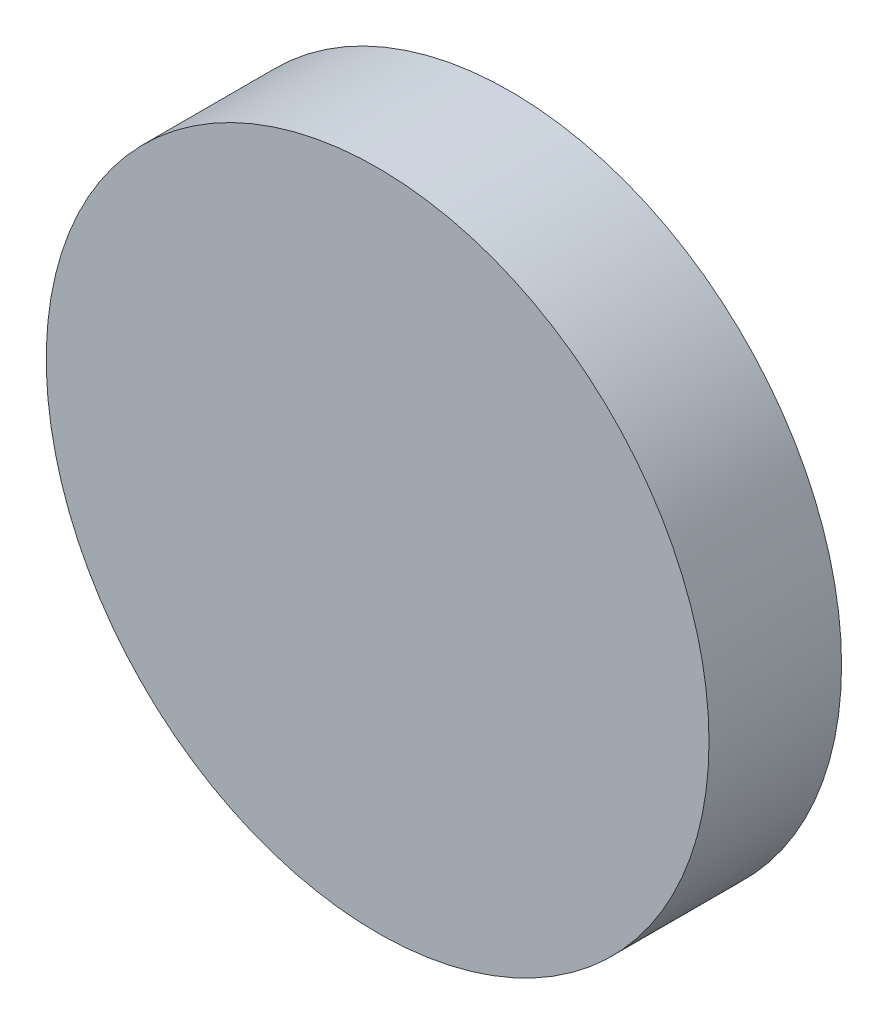
ISO-10303-21;
HEADER;
FILE_DESCRIPTION(('STEP AP214'),'2;1');
FILE_NAME('part.step','',(''),(''),'','','');
FILE_SCHEMA(('AUTOMOTIVE_DESIGN { 1 0 10303 214 1 1 1 1 }'));
ENDSEC;
DATA;
#1=APPLICATION_CONTEXT('core data for automotive mechanical design processes');
#2=APPLICATION_PROTOCOL_DEFINITION('international standard','automotive_design',2000,#1);
#3=PRODUCT_CONTEXT('',#1,'mechanical');
#4=PRODUCT('Part','Part','',(#3));
#5=PRODUCT_RELATED_PRODUCT_CATEGORY('part','',(#4));
#6=PRODUCT_DEFINITION_FORMATION('','',#4);
#7=PRODUCT_DEFINITION_CONTEXT('part definition',#1,'design');
#8=PRODUCT_DEFINITION('design','',#6,#7);
#9=PRODUCT_DEFINITION_SHAPE('','',#8);
#10=(LENGTH_UNIT() NAMED_UNIT(*) SI_UNIT(.MILLI.,.METRE.));
#11=(NAMED_UNIT(*) PLANE_ANGLE_UNIT() SI_UNIT($,.RADIAN.));
#12=(NAMED_UNIT(*) SI_UNIT($,.STERADIAN.) SOLID_ANGLE_UNIT());
#13=UNCERTAINTY_MEASURE_WITH_UNIT(LENGTH_MEASURE(1.E-05),#10,'distance_accuracy_value','');
#14=(GEOMETRIC_REPRESENTATION_CONTEXT(3) GLOBAL_UNCERTAINTY_ASSIGNED_CONTEXT((#13)) GLOBAL_UNIT_ASSIGNED_CONTEXT((#10,
#11,#12)) REPRESENTATION_CONTEXT('',''));
#15=CARTESIAN_POINT('',(0.,0.,0.));
#16=DIRECTION('',(0.,0.,1.));
#17=DIRECTION('',(1.,0.,0.));
#18=AXIS2_PLACEMENT_3D('',#15,#16,#17);
#19=CARTESIAN_POINT('',(0.,0.,6.35));
#20=DIRECTION('',(0.,0.,-1.));
#21=DIRECTION('',(-1.,0.,0.));
#22=AXIS2_PLACEMENT_3D('',#19,#20,#21);
#23=CYLINDRICAL_SURFACE('',#22,31.75);
#24=CARTESIAN_POINT('',(0.,0.,6.35));
#25=DIRECTION('',(0.,0.,1.));
#26=DIRECTION('',(1.,0.,0.));
#27=AXIS2_PLACEMENT_3D('',#24,#25,#26);
#28=CIRCLE('',#27,31.75);
#29=CARTESIAN_POINT('',(31.75,0.,6.35));
#30=VERTEX_POINT('',#29);
#31=EDGE_CURVE('E10',#30,#30,#28,.T.);
#32=ORIENTED_EDGE('',*,*,#31,.F.);
#33=EDGE_LOOP('',(#32));
#34=FACE_BOUND('',#33,.T.);
#35=CARTESIAN_POINT('',(0.,0.,-6.35));
#36=DIRECTION('',(0.,0.,1.));
#37=DIRECTION('',(1.,0.,0.));
#38=AXIS2_PLACEMENT_3D('',#35,#36,#37);
#39=CIRCLE('',#38,31.75);
#40=CARTESIAN_POINT('',(31.75,0.,-6.35));
#41=VERTEX_POINT('',#40);
#42=EDGE_CURVE('E37',#41,#41,#39,.T.);
#43=ORIENTED_EDGE('',*,*,#42,.T.);
#44=EDGE_LOOP('',(#43));
#45=FACE_BOUND('',#44,.T.);
#46=ADVANCED_FACE('F34',(#34,#45),#23,.T.);
#47=CARTESIAN_POINT('',(0.,0.,6.35));
#48=DIRECTION('',(0.,0.,1.));
#49=DIRECTION('',(1.,0.,0.));
#50=AXIS2_PLACEMENT_3D('',#47,#48,#49);
#51=PLANE('',#50);
#52=ORIENTED_EDGE('',*,*,#31,.T.);
#53=EDGE_LOOP('',(#52));
#54=FACE_BOUND('',#53,.T.);
#55=ADVANCED_FACE('F49',(#54),#51,.T.);
#56=CARTESIAN_POINT('',(0.,0.,-6.35));
#57=DIRECTION('',(0.,0.,1.));
#58=DIRECTION('',(1.,0.,0.));
#59=AXIS2_PLACEMENT_3D('',#56,#57,#58);
#60=PLANE('',#59);
#61=ORIENTED_EDGE('',*,*,#42,.F.);
#62=EDGE_LOOP('',(#61));
#63=FACE_BOUND('',#62,.T.);
#64=ADVANCED_FACE('F47',(#63),#60,.F.);
#65=CLOSED_SHELL('',(#46,#55,#64));
#66=MANIFOLD_SOLID_BREP('B2',#65);
#67=ADVANCED_BREP_SHAPE_REPRESENTATION('',(#18,#66),#14);
#68=SHAPE_DEFINITION_REPRESENTATION(#9,#67);
ENDSEC;
END-ISO-10303-21;
